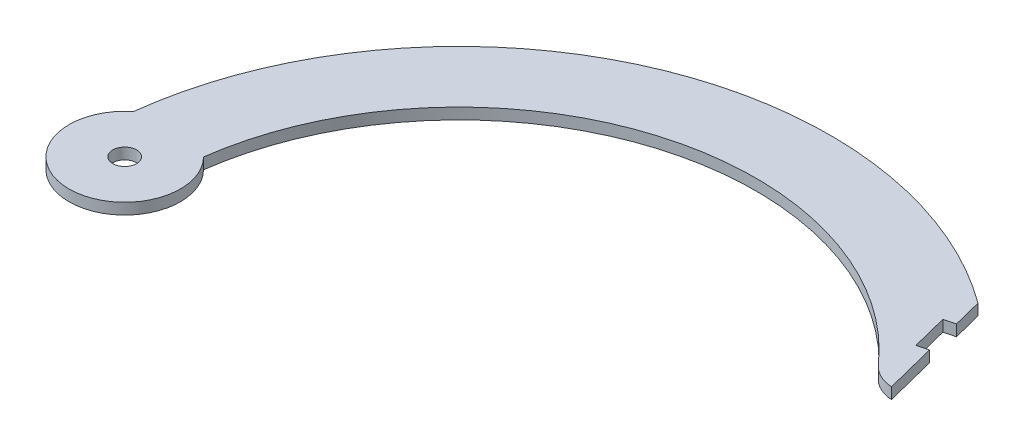
ISO-10303-21;
HEADER;
FILE_DESCRIPTION(('STEP AP214'),'2;1');
FILE_NAME('part.step','',(''),(''),'','','');
FILE_SCHEMA(('AUTOMOTIVE_DESIGN { 1 0 10303 214 1 1 1 1 }'));
ENDSEC;
DATA;
#1=APPLICATION_CONTEXT('core data for automotive mechanical design processes');
#2=APPLICATION_PROTOCOL_DEFINITION('international standard','automotive_design',2000,#1);
#3=PRODUCT_CONTEXT('',#1,'mechanical');
#4=PRODUCT('Part','Part','',(#3));
#5=PRODUCT_RELATED_PRODUCT_CATEGORY('part','',(#4));
#6=PRODUCT_DEFINITION_FORMATION('','',#4);
#7=PRODUCT_DEFINITION_CONTEXT('part definition',#1,'design');
#8=PRODUCT_DEFINITION('design','',#6,#7);
#9=PRODUCT_DEFINITION_SHAPE('','',#8);
#10=(LENGTH_UNIT() NAMED_UNIT(*) SI_UNIT(.MILLI.,.METRE.));
#11=(NAMED_UNIT(*) PLANE_ANGLE_UNIT() SI_UNIT($,.RADIAN.));
#12=(NAMED_UNIT(*) SI_UNIT($,.STERADIAN.) SOLID_ANGLE_UNIT());
#13=UNCERTAINTY_MEASURE_WITH_UNIT(LENGTH_MEASURE(1.E-05),#10,'distance_accuracy_value','');
#14=(GEOMETRIC_REPRESENTATION_CONTEXT(3) GLOBAL_UNCERTAINTY_ASSIGNED_CONTEXT((#13)) GLOBAL_UNIT_ASSIGNED_CONTEXT((#10,
#11,#12)) REPRESENTATION_CONTEXT('',''));
#15=CARTESIAN_POINT('',(0.,0.,0.));
#16=DIRECTION('',(0.,0.,1.));
#17=DIRECTION('',(1.,0.,0.));
#18=AXIS2_PLACEMENT_3D('',#15,#16,#17);
#19=CARTESIAN_POINT('',(60.508197076603,-0.01,-62.5392949185269));
#20=DIRECTION('',(0.244366086618921,0.,0.96968304909932));
#21=DIRECTION('',(0.96968304909932,0.,-0.244366086618921));
#22=AXIS2_PLACEMENT_3D('',#19,#20,#21);
#23=PLANE('',#22);
#24=DIRECTION('',(0.96968304909932,0.,-0.244366086618921));
#25=VECTOR('',#24,1.);
#26=CARTESIAN_POINT('',(-11.2059305435248,0.,-44.4668941086974));
#27=LINE('',#26,#25);
#28=CARTESIAN_POINT('',(60.508197076603,0.,-62.5392949185269));
#29=VERTEX_POINT('',#28);
#30=CARTESIAN_POINT('',(63.417246223901,0.,-63.2723931783837));
#31=VERTEX_POINT('',#30);
#32=EDGE_CURVE('E48',#29,#31,#27,.T.);
#33=ORIENTED_EDGE('',*,*,#32,.F.);
#34=DIRECTION('',(0.,1.,0.));
#35=VECTOR('',#34,1.);
#36=CARTESIAN_POINT('',(60.508197076603,-0.01,-62.5392949185269));
#37=LINE('',#36,#35);
#38=CARTESIAN_POINT('',(60.508197076603,3.,-62.5392949185269));
#39=VERTEX_POINT('',#38);
#40=EDGE_CURVE('E11',#29,#39,#37,.T.);
#41=ORIENTED_EDGE('',*,*,#40,.T.);
#42=DIRECTION('',(0.96968304909932,0.,-0.244366086618921));
#43=VECTOR('',#42,1.);
#44=CARTESIAN_POINT('',(-11.2059305435248,3.,-44.4668941086974));
#45=LINE('',#44,#43);
#46=CARTESIAN_POINT('',(63.417246223901,3.,-63.2723931783837));
#47=VERTEX_POINT('',#46);
#48=EDGE_CURVE('E172',#39,#47,#45,.T.);
#49=ORIENTED_EDGE('',*,*,#48,.T.);
#50=DIRECTION('',(0.,1.,0.));
#51=VECTOR('',#50,1.);
#52=CARTESIAN_POINT('',(63.417246223901,-0.01,-63.2723931783837));
#53=LINE('',#52,#51);
#54=EDGE_CURVE('E171',#31,#47,#53,.T.);
#55=ORIENTED_EDGE('',*,*,#54,.F.);
#56=EDGE_LOOP('',(#33,#41,#49,#55));
#57=FACE_BOUND('',#56,.T.);
#58=ADVANCED_FACE('F32',(#57),#23,.F.);
#59=CARTESIAN_POINT('',(58.0645362104138,-0.01,-72.2361254095201));
#60=DIRECTION('',(-0.969683049099322,0.,0.244366086618912));
#61=DIRECTION('',(0.244366086618912,0.,0.969683049099322));
#62=AXIS2_PLACEMENT_3D('',#59,#60,#61);
#63=PLANE('',#62);
#64=DIRECTION('',(0.,1.,0.));
#65=VECTOR('',#64,1.);
#66=CARTESIAN_POINT('',(58.0645362104138,-0.01,-72.2361254095201));
#67=LINE('',#66,#65);
#68=CARTESIAN_POINT('',(58.0645362104139,0.,-72.2361254095201));
#69=VERTEX_POINT('',#68);
#70=CARTESIAN_POINT('',(58.0645362104139,3.,-72.2361254095201));
#71=VERTEX_POINT('',#70);
#72=EDGE_CURVE('E41',#69,#71,#67,.T.);
#73=ORIENTED_EDGE('',*,*,#72,.T.);
#74=DIRECTION('',(0.244366086618912,0.,0.969683049099322));
#75=VECTOR('',#74,1.);
#76=CARTESIAN_POINT('',(71.7141276201275,3.,-18.0724008098287));
#77=LINE('',#76,#75);
#78=EDGE_CURVE('E175',#71,#39,#77,.T.);
#79=ORIENTED_EDGE('',*,*,#78,.T.);
#80=ORIENTED_EDGE('',*,*,#40,.F.);
#81=DIRECTION('',(0.244366086618912,0.,0.969683049099322));
#82=VECTOR('',#81,1.);
#83=CARTESIAN_POINT('',(71.7141276201275,0.,-18.0724008098287));
#84=LINE('',#83,#82);
#85=EDGE_CURVE('E55',#69,#29,#84,.T.);
#86=ORIENTED_EDGE('',*,*,#85,.F.);
#87=EDGE_LOOP('',(#73,#79,#80,#86));
#88=FACE_BOUND('',#87,.T.);
#89=ADVANCED_FACE('F201',(#88),#63,.F.);
#90=CARTESIAN_POINT('',(60.9735853577118,-0.01,-72.9692236693769));
#91=DIRECTION('',(-0.244366086618917,0.,-0.969683049099321));
#92=DIRECTION('',(-0.969683049099321,0.,0.244366086618917));
#93=AXIS2_PLACEMENT_3D('',#90,#91,#92);
#94=PLANE('',#93);
#95=DIRECTION('',(-0.969683049099321,0.,0.244366086618917));
#96=VECTOR('',#95,1.);
#97=CARTESIAN_POINT('',(-13.6495914097139,3.,-54.1637245996909));
#98=LINE('',#97,#96);
#99=CARTESIAN_POINT('',(60.9735853577118,3.,-72.9692236693769));
#100=VERTEX_POINT('',#99);
#101=EDGE_CURVE('E178',#100,#71,#98,.T.);
#102=ORIENTED_EDGE('',*,*,#101,.T.);
#103=ORIENTED_EDGE('',*,*,#72,.F.);
#104=DIRECTION('',(-0.969683049099321,0.,0.244366086618917));
#105=VECTOR('',#104,1.);
#106=CARTESIAN_POINT('',(-13.6495914097139,0.,-54.1637245996909));
#107=LINE('',#106,#105);
#108=CARTESIAN_POINT('',(60.9735853577118,0.,-72.9692236693769));
#109=VERTEX_POINT('',#108);
#110=EDGE_CURVE('E169',#109,#69,#107,.T.);
#111=ORIENTED_EDGE('',*,*,#110,.F.);
#112=DIRECTION('',(0.,-1.,0.));
#113=VECTOR('',#112,1.);
#114=CARTESIAN_POINT('',(60.9735853577118,-0.01,-72.9692236693769));
#115=LINE('',#114,#113);
#116=EDGE_CURVE('E36',#100,#109,#115,.T.);
#117=ORIENTED_EDGE('',*,*,#116,.F.);
#118=EDGE_LOOP('',(#102,#103,#111,#117));
#119=FACE_BOUND('',#118,.T.);
#120=ADVANCED_FACE('F34',(#119),#94,.F.);
#121=CARTESIAN_POINT('',(0.,3.,0.));
#122=DIRECTION('',(0.,-1.,0.));
#123=DIRECTION('',(0.,0.,-1.));
#124=AXIS2_PLACEMENT_3D('',#121,#122,#123);
#125=CYLINDRICAL_SURFACE('',#124,100.);
#126=CARTESIAN_POINT('',(0.,3.,0.));
#127=DIRECTION('',(0.,1.,0.));
#128=DIRECTION('',(0.,0.,1.));
#129=AXIS2_PLACEMENT_3D('',#126,#127,#128);
#130=CIRCLE('',#129,100.);
#131=CARTESIAN_POINT('',(59.0186566647604,3.,-80.7266880621714));
#132=VERTEX_POINT('',#131);
#133=CARTESIAN_POINT('',(-99.3111648741741,3.,-11.7171895663852));
#134=VERTEX_POINT('',#133);
#135=EDGE_CURVE('E129',#132,#134,#130,.T.);
#136=ORIENTED_EDGE('',*,*,#135,.F.);
#137=DIRECTION('',(0.,-1.,0.));
#138=VECTOR('',#137,1.);
#139=CARTESIAN_POINT('',(59.0186566647604,3.,-80.7266880621714));
#140=LINE('',#139,#138);
#141=CARTESIAN_POINT('',(59.0186566647604,0.,-80.7266880621714));
#142=VERTEX_POINT('',#141);
#143=EDGE_CURVE('E128',#132,#142,#140,.T.);
#144=ORIENTED_EDGE('',*,*,#143,.T.);
#145=CARTESIAN_POINT('',(0.,0.,0.));
#146=DIRECTION('',(0.,1.,0.));
#147=DIRECTION('',(0.,0.,1.));
#148=AXIS2_PLACEMENT_3D('',#145,#146,#147);
#149=CIRCLE('',#148,100.);
#150=CARTESIAN_POINT('',(-99.3111648741741,0.,-11.7171895663852));
#151=VERTEX_POINT('',#150);
#152=EDGE_CURVE('E118',#142,#151,#149,.T.);
#153=ORIENTED_EDGE('',*,*,#152,.T.);
#154=DIRECTION('',(0.,1.,0.));
#155=VECTOR('',#154,1.);
#156=CARTESIAN_POINT('',(-99.3111648741741,1.5,-11.7171895663852));
#157=LINE('',#156,#155);
#158=EDGE_CURVE('E138',#151,#134,#157,.T.);
#159=ORIENTED_EDGE('',*,*,#158,.T.);
#160=EDGE_LOOP('',(#136,#144,#153,#159));
#161=FACE_BOUND('',#160,.T.);
#162=ADVANCED_FACE('F193',(#161),#125,.T.);
#163=CARTESIAN_POINT('',(-89.9459383064186,0.,0.));
#164=DIRECTION('',(0.,1.,0.));
#165=DIRECTION('',(0.,0.,1.));
#166=AXIS2_PLACEMENT_3D('',#163,#164,#165);
#167=CYLINDRICAL_SURFACE('',#166,15.);
#168=ORIENTED_EDGE('',*,*,#158,.F.);
#169=CARTESIAN_POINT('',(-89.9459383064186,0.,0.));
#170=DIRECTION('',(0.,1.,0.));
#171=DIRECTION('',(0.,0.,1.));
#172=AXIS2_PLACEMENT_3D('',#169,#170,#171);
#173=CIRCLE('',#172,15.);
#174=CARTESIAN_POINT('',(-79.2991439436909,0.,-10.5662561864546));
#175=VERTEX_POINT('',#174);
#176=EDGE_CURVE('E127',#151,#175,#173,.T.);
#177=ORIENTED_EDGE('',*,*,#176,.T.);
#178=DIRECTION('',(0.,1.,0.));
#179=VECTOR('',#178,1.);
#180=CARTESIAN_POINT('',(-79.2991439436909,1.5,-10.5662561864546));
#181=LINE('',#180,#179);
#182=CARTESIAN_POINT('',(-79.2991439436909,3.,-10.5662561864546));
#183=VERTEX_POINT('',#182);
#184=EDGE_CURVE('E110',#175,#183,#181,.T.);
#185=ORIENTED_EDGE('',*,*,#184,.T.);
#186=CARTESIAN_POINT('',(-89.9459383064186,3.,0.));
#187=DIRECTION('',(0.,1.,0.));
#188=DIRECTION('',(0.,0.,1.));
#189=AXIS2_PLACEMENT_3D('',#186,#187,#188);
#190=CIRCLE('',#189,15.);
#191=EDGE_CURVE('E125',#134,#183,#190,.T.);
#192=ORIENTED_EDGE('',*,*,#191,.F.);
#193=EDGE_LOOP('',(#168,#177,#185,#192));
#194=FACE_BOUND('',#193,.T.);
#195=ADVANCED_FACE('F124',(#194),#167,.T.);
#196=CARTESIAN_POINT('',(0.,3.,0.));
#197=DIRECTION('',(0.,-1.,0.));
#198=DIRECTION('',(0.,0.,-1.));
#199=AXIS2_PLACEMENT_3D('',#196,#197,#198);
#200=CYLINDRICAL_SURFACE('',#199,80.);
#201=CARTESIAN_POINT('',(0.,0.,0.));
#202=DIRECTION('',(0.,1.,0.));
#203=DIRECTION('',(0.,0.,1.));
#204=AXIS2_PLACEMENT_3D('',#201,#202,#203);
#205=CIRCLE('',#204,80.);
#206=CARTESIAN_POINT('',(59.9663222422358,0.,-52.953188730617));
#207=VERTEX_POINT('',#206);
#208=EDGE_CURVE('E119',#207,#175,#205,.T.);
#209=ORIENTED_EDGE('',*,*,#208,.F.);
#210=DIRECTION('',(0.,-1.,0.));
#211=VECTOR('',#210,1.);
#212=CARTESIAN_POINT('',(59.9663222422358,3.,-52.953188730617));
#213=LINE('',#212,#211);
#214=CARTESIAN_POINT('',(59.9663222422357,3.,-52.953188730617));
#215=VERTEX_POINT('',#214);
#216=EDGE_CURVE('E113',#207,#215,#213,.F.);
#217=ORIENTED_EDGE('',*,*,#216,.T.);
#218=CARTESIAN_POINT('',(0.,3.,0.));
#219=DIRECTION('',(0.,1.,0.));
#220=DIRECTION('',(0.,0.,1.));
#221=AXIS2_PLACEMENT_3D('',#218,#219,#220);
#222=CIRCLE('',#221,80.);
#223=EDGE_CURVE('E106',#215,#183,#222,.T.);
#224=ORIENTED_EDGE('',*,*,#223,.T.);
#225=ORIENTED_EDGE('',*,*,#184,.F.);
#226=EDGE_LOOP('',(#209,#217,#224,#225));
#227=FACE_BOUND('',#226,.T.);
#228=ADVANCED_FACE('F109',(#227),#200,.F.);
#229=CARTESIAN_POINT('',(67.4621125225152,3.,-59.5723373219441));
#230=DIRECTION('',(0.,-1.,0.));
#231=DIRECTION('',(0.,0.,-1.));
#232=AXIS2_PLACEMENT_3D('',#229,#230,#231);
#233=CYLINDRICAL_SURFACE('',#232,10.);
#234=CARTESIAN_POINT('',(67.4621125225152,3.,-59.5723373219441));
#235=DIRECTION('',(0.,1.,0.));
#236=DIRECTION('',(0.,0.,1.));
#237=AXIS2_PLACEMENT_3D('',#234,#235,#236);
#238=CIRCLE('',#237,10.);
#239=CARTESIAN_POINT('',(66.865251706094,3.,-49.5901653555923));
#240=VERTEX_POINT('',#239);
#241=EDGE_CURVE('E165',#215,#240,#238,.T.);
#242=ORIENTED_EDGE('',*,*,#241,.F.);
#243=ORIENTED_EDGE('',*,*,#216,.F.);
#244=CARTESIAN_POINT('',(67.4621125225152,0.,-59.5723373219441));
#245=DIRECTION('',(0.,1.,0.));
#246=DIRECTION('',(0.,0.,1.));
#247=AXIS2_PLACEMENT_3D('',#244,#245,#246);
#248=CIRCLE('',#247,10.);
#249=CARTESIAN_POINT('',(66.865251706094,0.,-49.5901653555923));
#250=VERTEX_POINT('',#249);
#251=EDGE_CURVE('E162',#250,#207,#248,.F.);
#252=ORIENTED_EDGE('',*,*,#251,.F.);
#253=DIRECTION('',(0.,-1.,0.));
#254=VECTOR('',#253,1.);
#255=CARTESIAN_POINT('',(66.865251706094,-0.01,-49.5901653555923));
#256=LINE('',#255,#254);
#257=EDGE_CURVE('E155',#240,#250,#256,.T.);
#258=ORIENTED_EDGE('',*,*,#257,.F.);
#259=EDGE_LOOP('',(#242,#243,#252,#258));
#260=FACE_BOUND('',#259,.T.);
#261=ADVANCED_FACE('F210',(#260),#233,.T.);
#262=CARTESIAN_POINT('',(69.2820323027551,-0.01,-40.));
#263=DIRECTION('',(-0.96968304909932,0.,0.244366086618921));
#264=DIRECTION('',(0.244366086618921,0.,0.96968304909932));
#265=AXIS2_PLACEMENT_3D('',#262,#263,#264);
#266=PLANE('',#265);
#267=DIRECTION('',(0.244366086618921,0.,0.96968304909932));
#268=VECTOR('',#267,1.);
#269=CARTESIAN_POINT('',(74.6231767674258,0.,-18.8054990696863));
#270=LINE('',#269,#268);
#271=EDGE_CURVE('E151',#31,#250,#270,.T.);
#272=ORIENTED_EDGE('',*,*,#271,.F.);
#273=ORIENTED_EDGE('',*,*,#54,.T.);
#274=DIRECTION('',(0.244366086618921,0.,0.96968304909932));
#275=VECTOR('',#274,1.);
#276=CARTESIAN_POINT('',(74.6231767674258,3.,-18.8054990696863));
#277=LINE('',#276,#275);
#278=EDGE_CURVE('E156',#47,#240,#277,.T.);
#279=ORIENTED_EDGE('',*,*,#278,.T.);
#280=ORIENTED_EDGE('',*,*,#257,.T.);
#281=EDGE_LOOP('',(#272,#273,#279,#280));
#282=FACE_BOUND('',#281,.T.);
#283=ADVANCED_FACE('F212',(#282),#266,.F.);
#284=EDGE_CURVE('E152',#132,#100,#277,.T.);
#285=ORIENTED_EDGE('',*,*,#284,.T.);
#286=ORIENTED_EDGE('',*,*,#116,.T.);
#287=EDGE_CURVE('E157',#142,#109,#270,.T.);
#288=ORIENTED_EDGE('',*,*,#287,.F.);
#289=ORIENTED_EDGE('',*,*,#143,.F.);
#290=EDGE_LOOP('',(#285,#286,#288,#289));
#291=FACE_BOUND('',#290,.T.);
#292=ADVANCED_FACE('F185',(#291),#266,.F.);
#293=CARTESIAN_POINT('',(-89.9459383064186,0.,0.));
#294=DIRECTION('',(0.,1.,0.));
#295=DIRECTION('',(0.,0.,1.));
#296=AXIS2_PLACEMENT_3D('',#293,#294,#295);
#297=CYLINDRICAL_SURFACE('',#296,3.21000000000001);
#298=CARTESIAN_POINT('',(-89.9459383064186,0.,0.));
#299=DIRECTION('',(0.,1.,0.));
#300=DIRECTION('',(0.,0.,1.));
#301=AXIS2_PLACEMENT_3D('',#298,#299,#300);
#302=CIRCLE('',#301,3.21000000000001);
#303=CARTESIAN_POINT('',(-89.9459383064186,0.,3.21000000000001));
#304=VERTEX_POINT('',#303);
#305=EDGE_CURVE('E136',#304,#304,#302,.T.);
#306=ORIENTED_EDGE('',*,*,#305,.F.);
#307=EDGE_LOOP('',(#306));
#308=FACE_BOUND('',#307,.T.);
#309=CARTESIAN_POINT('',(-89.9459383064186,3.,0.));
#310=DIRECTION('',(0.,1.,0.));
#311=DIRECTION('',(0.,0.,1.));
#312=AXIS2_PLACEMENT_3D('',#309,#310,#311);
#313=CIRCLE('',#312,3.21000000000001);
#314=CARTESIAN_POINT('',(-89.9459383064186,3.,3.21000000000001));
#315=VERTEX_POINT('',#314);
#316=EDGE_CURVE('E141',#315,#315,#313,.T.);
#317=ORIENTED_EDGE('',*,*,#316,.T.);
#318=EDGE_LOOP('',(#317));
#319=FACE_BOUND('',#318,.T.);
#320=ADVANCED_FACE('F218',(#308,#319),#297,.F.);
#321=CARTESIAN_POINT('',(0.,0.,0.));
#322=DIRECTION('',(0.,1.,0.));
#323=DIRECTION('',(0.,0.,1.));
#324=AXIS2_PLACEMENT_3D('',#321,#322,#323);
#325=PLANE('',#324);
#326=ORIENTED_EDGE('',*,*,#305,.T.);
#327=EDGE_LOOP('',(#326));
#328=FACE_BOUND('',#327,.T.);
#329=ORIENTED_EDGE('',*,*,#287,.T.);
#330=ORIENTED_EDGE('',*,*,#110,.T.);
#331=ORIENTED_EDGE('',*,*,#85,.T.);
#332=ORIENTED_EDGE('',*,*,#32,.T.);
#333=ORIENTED_EDGE('',*,*,#271,.T.);
#334=ORIENTED_EDGE('',*,*,#251,.T.);
#335=ORIENTED_EDGE('',*,*,#208,.T.);
#336=ORIENTED_EDGE('',*,*,#176,.F.);
#337=ORIENTED_EDGE('',*,*,#152,.F.);
#338=EDGE_LOOP('',(#329,#330,#331,#332,#333,#334,#335,#336,#337));
#339=FACE_BOUND('',#338,.T.);
#340=ADVANCED_FACE('F191',(#328,#339),#325,.F.);
#341=CARTESIAN_POINT('',(0.,3.,0.));
#342=DIRECTION('',(0.,1.,0.));
#343=DIRECTION('',(0.,0.,1.));
#344=AXIS2_PLACEMENT_3D('',#341,#342,#343);
#345=PLANE('',#344);
#346=ORIENTED_EDGE('',*,*,#101,.F.);
#347=ORIENTED_EDGE('',*,*,#284,.F.);
#348=ORIENTED_EDGE('',*,*,#135,.T.);
#349=ORIENTED_EDGE('',*,*,#191,.T.);
#350=ORIENTED_EDGE('',*,*,#223,.F.);
#351=ORIENTED_EDGE('',*,*,#241,.T.);
#352=ORIENTED_EDGE('',*,*,#278,.F.);
#353=ORIENTED_EDGE('',*,*,#48,.F.);
#354=ORIENTED_EDGE('',*,*,#78,.F.);
#355=EDGE_LOOP('',(#346,#347,#348,#349,#350,#351,#352,#353,#354));
#356=FACE_BOUND('',#355,.T.);
#357=ORIENTED_EDGE('',*,*,#316,.F.);
#358=EDGE_LOOP('',(#357));
#359=FACE_BOUND('',#358,.T.);
#360=ADVANCED_FACE('F132',(#356,#359),#345,.T.);
#361=CLOSED_SHELL('',(#58,#89,#120,#162,#195,#228,#261,#283,#292,#320,#340,#360));
#362=MANIFOLD_SOLID_BREP('B2',#361);
#363=ADVANCED_BREP_SHAPE_REPRESENTATION('',(#18,#362),#14);
#364=SHAPE_DEFINITION_REPRESENTATION(#9,#363);
ENDSEC;
END-ISO-10303-21;
